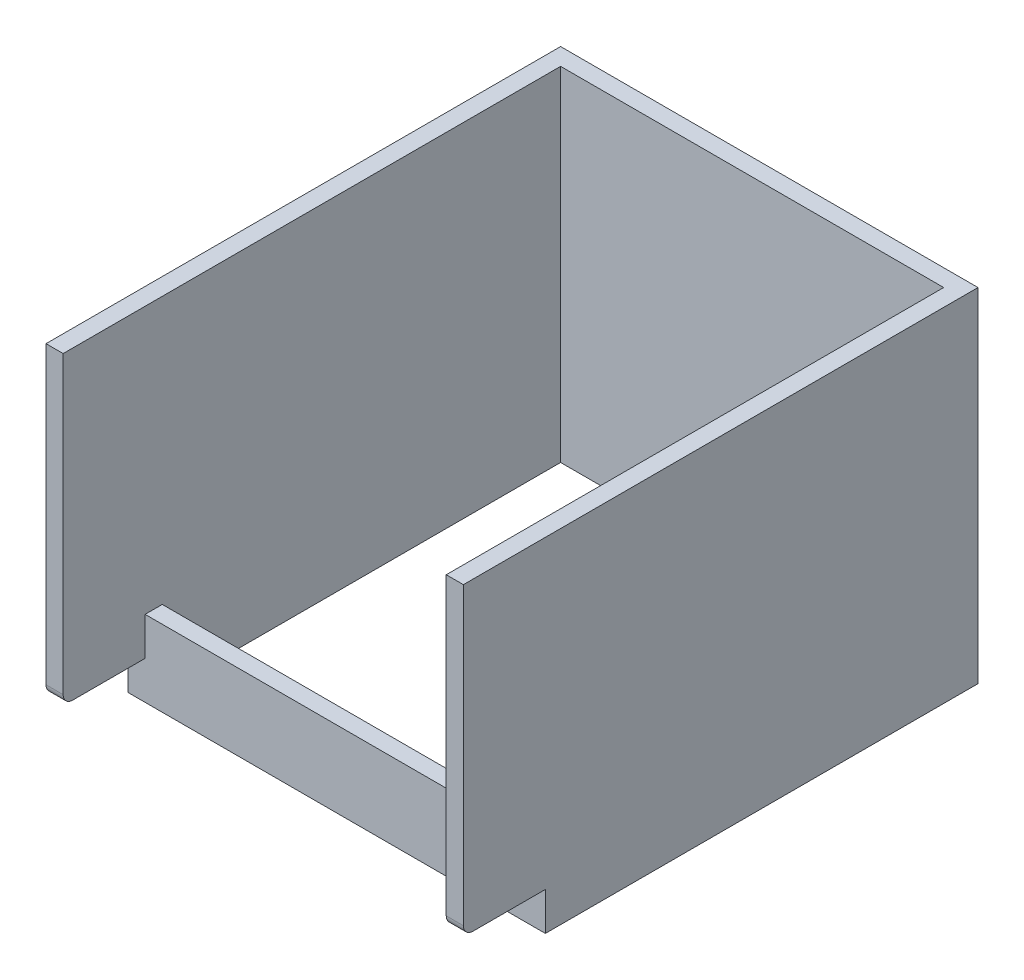
ISO-10303-21;
HEADER;
FILE_DESCRIPTION(('STEP AP214'),'2;1');
FILE_NAME('part.step','',(''),(''),'','','');
FILE_SCHEMA(('AUTOMOTIVE_DESIGN { 1 0 10303 214 1 1 1 1 }'));
ENDSEC;
DATA;
#1=APPLICATION_CONTEXT('core data for automotive mechanical design processes');
#2=APPLICATION_PROTOCOL_DEFINITION('international standard','automotive_design',2000,#1);
#3=PRODUCT_CONTEXT('',#1,'mechanical');
#4=PRODUCT('Part','Part','',(#3));
#5=PRODUCT_RELATED_PRODUCT_CATEGORY('part','',(#4));
#6=PRODUCT_DEFINITION_FORMATION('','',#4);
#7=PRODUCT_DEFINITION_CONTEXT('part definition',#1,'design');
#8=PRODUCT_DEFINITION('design','',#6,#7);
#9=PRODUCT_DEFINITION_SHAPE('','',#8);
#10=(LENGTH_UNIT() NAMED_UNIT(*) SI_UNIT(.MILLI.,.METRE.));
#11=(NAMED_UNIT(*) PLANE_ANGLE_UNIT() SI_UNIT($,.RADIAN.));
#12=(NAMED_UNIT(*) SI_UNIT($,.STERADIAN.) SOLID_ANGLE_UNIT());
#13=UNCERTAINTY_MEASURE_WITH_UNIT(LENGTH_MEASURE(1.E-05),#10,'distance_accuracy_value','');
#14=(GEOMETRIC_REPRESENTATION_CONTEXT(3) GLOBAL_UNCERTAINTY_ASSIGNED_CONTEXT((#13)) GLOBAL_UNIT_ASSIGNED_CONTEXT((#10,
#11,#12)) REPRESENTATION_CONTEXT('',''));
#15=CARTESIAN_POINT('',(0.,0.,0.));
#16=DIRECTION('',(0.,0.,1.));
#17=DIRECTION('',(1.,0.,0.));
#18=AXIS2_PLACEMENT_3D('',#15,#16,#17);
#19=CARTESIAN_POINT('',(0.,0.,0.));
#20=DIRECTION('',(0.,-1.,0.));
#21=DIRECTION('',(0.,0.,-1.));
#22=AXIS2_PLACEMENT_3D('',#19,#20,#21);
#23=PLANE('',#22);
#24=DIRECTION('',(0.,0.,-1.));
#25=VECTOR('',#24,1.);
#26=CARTESIAN_POINT('',(109.5,0.,125.));
#27=LINE('',#26,#25);
#28=CARTESIAN_POINT('',(109.5,0.,102.));
#29=VERTEX_POINT('',#28);
#30=CARTESIAN_POINT('',(109.5,0.,-125.));
#31=VERTEX_POINT('',#30);
#32=EDGE_CURVE('E245',#29,#31,#27,.T.);
#33=ORIENTED_EDGE('',*,*,#32,.F.);
#34=DIRECTION('',(1.,0.,0.));
#35=VECTOR('',#34,1.);
#36=CARTESIAN_POINT('',(-109.5,0.,102.));
#37=LINE('',#36,#35);
#38=CARTESIAN_POINT('',(-109.5,0.,102.));
#39=VERTEX_POINT('',#38);
#40=EDGE_CURVE('E199',#39,#29,#37,.T.);
#41=ORIENTED_EDGE('',*,*,#40,.F.);
#42=DIRECTION('',(0.,0.,1.));
#43=VECTOR('',#42,1.);
#44=CARTESIAN_POINT('',(-109.5,0.,125.));
#45=LINE('',#44,#43);
#46=CARTESIAN_POINT('',(-109.5,0.,-125.));
#47=VERTEX_POINT('',#46);
#48=EDGE_CURVE('E249',#47,#39,#45,.T.);
#49=ORIENTED_EDGE('',*,*,#48,.F.);
#50=DIRECTION('',(-1.,0.,0.));
#51=VECTOR('',#50,1.);
#52=CARTESIAN_POINT('',(-109.5,0.,-125.));
#53=LINE('',#52,#51);
#54=EDGE_CURVE('E247',#31,#47,#53,.T.);
#55=ORIENTED_EDGE('',*,*,#54,.F.);
#56=EDGE_LOOP('',(#33,#41,#49,#55));
#57=FACE_BOUND('',#56,.T.);
#58=DIRECTION('',(-1.,0.,0.));
#59=VECTOR('',#58,1.);
#60=CARTESIAN_POINT('',(-100.5,0.,-116.));
#61=LINE('',#60,#59);
#62=CARTESIAN_POINT('',(100.5,0.,-116.));
#63=VERTEX_POINT('',#62);
#64=CARTESIAN_POINT('',(-100.5,0.,-116.));
#65=VERTEX_POINT('',#64);
#66=EDGE_CURVE('E167',#63,#65,#61,.T.);
#67=ORIENTED_EDGE('',*,*,#66,.T.);
#68=DIRECTION('',(0.,0.,1.));
#69=VECTOR('',#68,1.);
#70=CARTESIAN_POINT('',(-100.5,0.,-116.));
#71=LINE('',#70,#69);
#72=CARTESIAN_POINT('',(-100.5,0.,93.));
#73=VERTEX_POINT('',#72);
#74=EDGE_CURVE('E149',#65,#73,#71,.T.);
#75=ORIENTED_EDGE('',*,*,#74,.T.);
#76=DIRECTION('',(1.,0.,0.));
#77=VECTOR('',#76,1.);
#78=CARTESIAN_POINT('',(-100.5,0.,93.));
#79=LINE('',#78,#77);
#80=CARTESIAN_POINT('',(100.5,0.,93.));
#81=VERTEX_POINT('',#80);
#82=EDGE_CURVE('E160',#73,#81,#79,.T.);
#83=ORIENTED_EDGE('',*,*,#82,.T.);
#84=DIRECTION('',(0.,0.,-1.));
#85=VECTOR('',#84,1.);
#86=CARTESIAN_POINT('',(100.5,0.,-116.));
#87=LINE('',#86,#85);
#88=EDGE_CURVE('E165',#81,#63,#87,.T.);
#89=ORIENTED_EDGE('',*,*,#88,.T.);
#90=EDGE_LOOP('',(#67,#75,#83,#89));
#91=FACE_BOUND('',#90,.T.);
#92=ADVANCED_FACE('F32',(#57,#91),#23,.T.);
#93=CARTESIAN_POINT('',(-100.5,180.,125.));
#94=DIRECTION('',(-1.,0.,0.));
#95=DIRECTION('',(0.,0.,1.));
#96=AXIS2_PLACEMENT_3D('',#93,#94,#95);
#97=PLANE('',#96);
#98=DIRECTION('',(0.,-1.,0.));
#99=VECTOR('',#98,1.);
#100=CARTESIAN_POINT('',(-100.5,40.,93.));
#101=LINE('',#100,#99);
#102=CARTESIAN_POINT('',(-100.5,40.,93.));
#103=VERTEX_POINT('',#102);
#104=EDGE_CURVE('E145',#103,#73,#101,.T.);
#105=ORIENTED_EDGE('',*,*,#104,.T.);
#106=ORIENTED_EDGE('',*,*,#74,.F.);
#107=DIRECTION('',(0.,-1.,0.));
#108=VECTOR('',#107,1.);
#109=CARTESIAN_POINT('',(-100.5,180.,-116.));
#110=LINE('',#109,#108);
#111=CARTESIAN_POINT('',(-100.5,180.,-116.));
#112=VERTEX_POINT('',#111);
#113=EDGE_CURVE('E47',#112,#65,#110,.T.);
#114=ORIENTED_EDGE('',*,*,#113,.F.);
#115=DIRECTION('',(0.,0.,-1.));
#116=VECTOR('',#115,1.);
#117=CARTESIAN_POINT('',(-100.5,180.,125.));
#118=LINE('',#117,#116);
#119=CARTESIAN_POINT('',(-100.5,180.,145.));
#120=VERTEX_POINT('',#119);
#121=EDGE_CURVE('E227',#120,#112,#118,.T.);
#122=ORIENTED_EDGE('',*,*,#121,.F.);
#123=DIRECTION('',(0.,-1.,0.));
#124=VECTOR('',#123,1.);
#125=CARTESIAN_POINT('',(-100.5,180.,145.));
#126=LINE('',#125,#124);
#127=CARTESIAN_POINT('',(-100.5,25.,145.));
#128=VERTEX_POINT('',#127);
#129=EDGE_CURVE('E235',#120,#128,#126,.T.);
#130=ORIENTED_EDGE('',*,*,#129,.T.);
#131=CARTESIAN_POINT('',(-100.5,25.,140.));
#132=DIRECTION('',(-1.,0.,0.));
#133=DIRECTION('',(0.,0.,1.));
#134=AXIS2_PLACEMENT_3D('',#131,#132,#133);
#135=CIRCLE('',#134,5.);
#136=CARTESIAN_POINT('',(-100.5,20.,140.));
#137=VERTEX_POINT('',#136);
#138=EDGE_CURVE('E265',#128,#137,#135,.F.);
#139=ORIENTED_EDGE('',*,*,#138,.T.);
#140=DIRECTION('',(0.,0.,-1.));
#141=VECTOR('',#140,1.);
#142=CARTESIAN_POINT('',(-100.5,20.,125.));
#143=LINE('',#142,#141);
#144=CARTESIAN_POINT('',(-100.5,20.,102.));
#145=VERTEX_POINT('',#144);
#146=EDGE_CURVE('E203',#137,#145,#143,.T.);
#147=ORIENTED_EDGE('',*,*,#146,.T.);
#148=DIRECTION('',(0.,-1.,0.));
#149=VECTOR('',#148,1.);
#150=CARTESIAN_POINT('',(-100.5,40.,102.));
#151=LINE('',#150,#149);
#152=CARTESIAN_POINT('',(-100.5,40.,102.));
#153=VERTEX_POINT('',#152);
#154=EDGE_CURVE('E184',#153,#145,#151,.T.);
#155=ORIENTED_EDGE('',*,*,#154,.F.);
#156=DIRECTION('',(0.,0.,1.));
#157=VECTOR('',#156,1.);
#158=CARTESIAN_POINT('',(-100.5,40.,102.));
#159=LINE('',#158,#157);
#160=EDGE_CURVE('E152',#103,#153,#159,.T.);
#161=ORIENTED_EDGE('',*,*,#160,.F.);
#162=EDGE_LOOP('',(#105,#106,#114,#122,#130,#139,#147,#155,#161));
#163=FACE_BOUND('',#162,.T.);
#164=ADVANCED_FACE('F147',(#163),#97,.F.);
#165=CARTESIAN_POINT('',(100.5,180.,-125.));
#166=DIRECTION('',(1.,0.,0.));
#167=DIRECTION('',(0.,0.,-1.));
#168=AXIS2_PLACEMENT_3D('',#165,#166,#167);
#169=PLANE('',#168);
#170=DIRECTION('',(0.,-1.,0.));
#171=VECTOR('',#170,1.);
#172=CARTESIAN_POINT('',(100.5,180.,-116.));
#173=LINE('',#172,#171);
#174=CARTESIAN_POINT('',(100.5,180.,-116.));
#175=VERTEX_POINT('',#174);
#176=EDGE_CURVE('E232',#175,#63,#173,.T.);
#177=ORIENTED_EDGE('',*,*,#176,.T.);
#178=ORIENTED_EDGE('',*,*,#88,.F.);
#179=DIRECTION('',(0.,-1.,0.));
#180=VECTOR('',#179,1.);
#181=CARTESIAN_POINT('',(100.5,40.,93.));
#182=LINE('',#181,#180);
#183=CARTESIAN_POINT('',(100.5,40.,93.));
#184=VERTEX_POINT('',#183);
#185=EDGE_CURVE('E156',#184,#81,#182,.T.);
#186=ORIENTED_EDGE('',*,*,#185,.F.);
#187=DIRECTION('',(0.,0.,-1.));
#188=VECTOR('',#187,1.);
#189=CARTESIAN_POINT('',(100.5,40.,102.));
#190=LINE('',#189,#188);
#191=CARTESIAN_POINT('',(100.5,40.,102.));
#192=VERTEX_POINT('',#191);
#193=EDGE_CURVE('E176',#192,#184,#190,.T.);
#194=ORIENTED_EDGE('',*,*,#193,.F.);
#195=DIRECTION('',(0.,-1.,0.));
#196=VECTOR('',#195,1.);
#197=CARTESIAN_POINT('',(100.5,40.,102.));
#198=LINE('',#197,#196);
#199=CARTESIAN_POINT('',(100.5,20.,102.));
#200=VERTEX_POINT('',#199);
#201=EDGE_CURVE('E181',#192,#200,#198,.T.);
#202=ORIENTED_EDGE('',*,*,#201,.T.);
#203=DIRECTION('',(0.,0.,1.));
#204=VECTOR('',#203,1.);
#205=CARTESIAN_POINT('',(100.5,20.,-125.));
#206=LINE('',#205,#204);
#207=CARTESIAN_POINT('',(100.5,20.,140.));
#208=VERTEX_POINT('',#207);
#209=EDGE_CURVE('E207',#200,#208,#206,.T.);
#210=ORIENTED_EDGE('',*,*,#209,.T.);
#211=CARTESIAN_POINT('',(100.5,25.,140.));
#212=DIRECTION('',(1.,0.,0.));
#213=DIRECTION('',(0.,0.,-1.));
#214=AXIS2_PLACEMENT_3D('',#211,#212,#213);
#215=CIRCLE('',#214,5.);
#216=CARTESIAN_POINT('',(100.5,25.,145.));
#217=VERTEX_POINT('',#216);
#218=EDGE_CURVE('E270',#208,#217,#215,.F.);
#219=ORIENTED_EDGE('',*,*,#218,.T.);
#220=DIRECTION('',(0.,-1.,0.));
#221=VECTOR('',#220,1.);
#222=CARTESIAN_POINT('',(100.5,180.,145.));
#223=LINE('',#222,#221);
#224=CARTESIAN_POINT('',(100.5,180.,145.));
#225=VERTEX_POINT('',#224);
#226=EDGE_CURVE('E243',#225,#217,#223,.T.);
#227=ORIENTED_EDGE('',*,*,#226,.F.);
#228=DIRECTION('',(0.,0.,1.));
#229=VECTOR('',#228,1.);
#230=CARTESIAN_POINT('',(100.5,180.,125.));
#231=LINE('',#230,#229);
#232=EDGE_CURVE('E210',#175,#225,#231,.T.);
#233=ORIENTED_EDGE('',*,*,#232,.F.);
#234=EDGE_LOOP('',(#177,#178,#186,#194,#202,#210,#219,#227,#233));
#235=FACE_BOUND('',#234,.T.);
#236=ADVANCED_FACE('F273',(#235),#169,.F.);
#237=CARTESIAN_POINT('',(109.5,3.,125.));
#238=DIRECTION('',(-1.,0.,0.));
#239=DIRECTION('',(0.,0.,1.));
#240=AXIS2_PLACEMENT_3D('',#237,#238,#239);
#241=PLANE('',#240);
#242=DIRECTION('',(0.,-1.,0.));
#243=VECTOR('',#242,1.);
#244=CARTESIAN_POINT('',(109.5,180.,145.));
#245=LINE('',#244,#243);
#246=CARTESIAN_POINT('',(109.5,180.,145.));
#247=VERTEX_POINT('',#246);
#248=CARTESIAN_POINT('',(109.5,25.,145.));
#249=VERTEX_POINT('',#248);
#250=EDGE_CURVE('E241',#247,#249,#245,.T.);
#251=ORIENTED_EDGE('',*,*,#250,.T.);
#252=CARTESIAN_POINT('',(109.5,25.,140.));
#253=DIRECTION('',(-1.,0.,0.));
#254=DIRECTION('',(0.,0.,1.));
#255=AXIS2_PLACEMENT_3D('',#252,#253,#254);
#256=CIRCLE('',#255,5.);
#257=CARTESIAN_POINT('',(109.5,20.,140.));
#258=VERTEX_POINT('',#257);
#259=EDGE_CURVE('E11',#249,#258,#256,.F.);
#260=ORIENTED_EDGE('',*,*,#259,.T.);
#261=DIRECTION('',(0.,0.,1.));
#262=VECTOR('',#261,1.);
#263=CARTESIAN_POINT('',(109.5,20.,167.933085687635));
#264=LINE('',#263,#262);
#265=CARTESIAN_POINT('',(109.5,20.,102.));
#266=VERTEX_POINT('',#265);
#267=EDGE_CURVE('E190',#266,#258,#264,.T.);
#268=ORIENTED_EDGE('',*,*,#267,.F.);
#269=DIRECTION('',(0.,1.,0.));
#270=VECTOR('',#269,1.);
#271=CARTESIAN_POINT('',(109.5,0.,102.));
#272=LINE('',#271,#270);
#273=EDGE_CURVE('E187',#29,#266,#272,.T.);
#274=ORIENTED_EDGE('',*,*,#273,.F.);
#275=ORIENTED_EDGE('',*,*,#32,.T.);
#276=DIRECTION('',(0.,-1.,0.));
#277=VECTOR('',#276,1.);
#278=CARTESIAN_POINT('',(109.5,3.,-125.));
#279=LINE('',#278,#277);
#280=CARTESIAN_POINT('',(109.5,180.,-125.));
#281=VERTEX_POINT('',#280);
#282=EDGE_CURVE('E255',#281,#31,#279,.T.);
#283=ORIENTED_EDGE('',*,*,#282,.F.);
#284=DIRECTION('',(0.,0.,1.));
#285=VECTOR('',#284,1.);
#286=CARTESIAN_POINT('',(109.5,180.,125.));
#287=LINE('',#286,#285);
#288=EDGE_CURVE('E215',#281,#247,#287,.T.);
#289=ORIENTED_EDGE('',*,*,#288,.T.);
#290=EDGE_LOOP('',(#251,#260,#268,#274,#275,#283,#289));
#291=FACE_BOUND('',#290,.T.);
#292=ADVANCED_FACE('F282',(#291),#241,.F.);
#293=CARTESIAN_POINT('',(-109.5,3.,-125.));
#294=DIRECTION('',(0.,0.,1.));
#295=DIRECTION('',(1.,0.,0.));
#296=AXIS2_PLACEMENT_3D('',#293,#294,#295);
#297=PLANE('',#296);
#298=ORIENTED_EDGE('',*,*,#54,.T.);
#299=DIRECTION('',(0.,-1.,0.));
#300=VECTOR('',#299,1.);
#301=CARTESIAN_POINT('',(-109.5,3.,-125.));
#302=LINE('',#301,#300);
#303=CARTESIAN_POINT('',(-109.5,180.,-125.));
#304=VERTEX_POINT('',#303);
#305=EDGE_CURVE('E252',#304,#47,#302,.T.);
#306=ORIENTED_EDGE('',*,*,#305,.F.);
#307=DIRECTION('',(1.,0.,0.));
#308=VECTOR('',#307,1.);
#309=CARTESIAN_POINT('',(-109.5,180.,-125.));
#310=LINE('',#309,#308);
#311=EDGE_CURVE('E218',#304,#281,#310,.T.);
#312=ORIENTED_EDGE('',*,*,#311,.T.);
#313=ORIENTED_EDGE('',*,*,#282,.T.);
#314=EDGE_LOOP('',(#298,#306,#312,#313));
#315=FACE_BOUND('',#314,.T.);
#316=ADVANCED_FACE('F295',(#315),#297,.F.);
#317=CARTESIAN_POINT('',(-109.5,3.,125.));
#318=DIRECTION('',(1.,0.,0.));
#319=DIRECTION('',(0.,0.,-1.));
#320=AXIS2_PLACEMENT_3D('',#317,#318,#319);
#321=PLANE('',#320);
#322=DIRECTION('',(0.,0.,1.));
#323=VECTOR('',#322,1.);
#324=CARTESIAN_POINT('',(-109.5,20.,167.933085687635));
#325=LINE('',#324,#323);
#326=CARTESIAN_POINT('',(-109.5,20.,102.));
#327=VERTEX_POINT('',#326);
#328=CARTESIAN_POINT('',(-109.5,20.,140.));
#329=VERTEX_POINT('',#328);
#330=EDGE_CURVE('E196',#327,#329,#325,.T.);
#331=ORIENTED_EDGE('',*,*,#330,.T.);
#332=CARTESIAN_POINT('',(-109.5,25.,140.));
#333=DIRECTION('',(1.,0.,0.));
#334=DIRECTION('',(0.,0.,-1.));
#335=AXIS2_PLACEMENT_3D('',#332,#333,#334);
#336=CIRCLE('',#335,5.);
#337=CARTESIAN_POINT('',(-109.5,25.,145.));
#338=VERTEX_POINT('',#337);
#339=EDGE_CURVE('E261',#329,#338,#336,.F.);
#340=ORIENTED_EDGE('',*,*,#339,.T.);
#341=DIRECTION('',(0.,-1.,0.));
#342=VECTOR('',#341,1.);
#343=CARTESIAN_POINT('',(-109.5,180.,145.));
#344=LINE('',#343,#342);
#345=CARTESIAN_POINT('',(-109.5,180.,145.));
#346=VERTEX_POINT('',#345);
#347=EDGE_CURVE('E238',#346,#338,#344,.T.);
#348=ORIENTED_EDGE('',*,*,#347,.F.);
#349=DIRECTION('',(0.,0.,-1.));
#350=VECTOR('',#349,1.);
#351=CARTESIAN_POINT('',(-109.5,180.,125.));
#352=LINE('',#351,#350);
#353=EDGE_CURVE('E221',#346,#304,#352,.T.);
#354=ORIENTED_EDGE('',*,*,#353,.T.);
#355=ORIENTED_EDGE('',*,*,#305,.T.);
#356=ORIENTED_EDGE('',*,*,#48,.T.);
#357=DIRECTION('',(0.,1.,0.));
#358=VECTOR('',#357,1.);
#359=CARTESIAN_POINT('',(-109.5,0.,102.));
#360=LINE('',#359,#358);
#361=EDGE_CURVE('E193',#39,#327,#360,.T.);
#362=ORIENTED_EDGE('',*,*,#361,.T.);
#363=EDGE_LOOP('',(#331,#340,#348,#354,#355,#356,#362));
#364=FACE_BOUND('',#363,.T.);
#365=ADVANCED_FACE('F303',(#364),#321,.F.);
#366=CARTESIAN_POINT('',(-109.5,180.,-116.));
#367=DIRECTION('',(0.,0.,-1.));
#368=DIRECTION('',(-1.,0.,0.));
#369=AXIS2_PLACEMENT_3D('',#366,#367,#368);
#370=PLANE('',#369);
#371=ORIENTED_EDGE('',*,*,#113,.T.);
#372=ORIENTED_EDGE('',*,*,#66,.F.);
#373=ORIENTED_EDGE('',*,*,#176,.F.);
#374=DIRECTION('',(1.,0.,0.));
#375=VECTOR('',#374,1.);
#376=CARTESIAN_POINT('',(-109.5,180.,-116.));
#377=LINE('',#376,#375);
#378=EDGE_CURVE('E229',#112,#175,#377,.T.);
#379=ORIENTED_EDGE('',*,*,#378,.F.);
#380=EDGE_LOOP('',(#371,#372,#373,#379));
#381=FACE_BOUND('',#380,.T.);
#382=ADVANCED_FACE('F301',(#381),#370,.F.);
#383=CARTESIAN_POINT('',(109.5,180.,145.));
#384=DIRECTION('',(0.,0.,1.));
#385=DIRECTION('',(1.,0.,0.));
#386=AXIS2_PLACEMENT_3D('',#383,#384,#385);
#387=PLANE('',#386);
#388=ORIENTED_EDGE('',*,*,#226,.T.);
#389=DIRECTION('',(-1.,0.,0.));
#390=VECTOR('',#389,1.);
#391=CARTESIAN_POINT('',(109.5,25.,145.));
#392=LINE('',#391,#390);
#393=EDGE_CURVE('E40',#217,#249,#392,.F.);
#394=ORIENTED_EDGE('',*,*,#393,.T.);
#395=ORIENTED_EDGE('',*,*,#250,.F.);
#396=DIRECTION('',(-1.,0.,0.));
#397=VECTOR('',#396,1.);
#398=CARTESIAN_POINT('',(109.5,180.,145.));
#399=LINE('',#398,#397);
#400=EDGE_CURVE('E212',#247,#225,#399,.T.);
#401=ORIENTED_EDGE('',*,*,#400,.T.);
#402=EDGE_LOOP('',(#388,#394,#395,#401));
#403=FACE_BOUND('',#402,.T.);
#404=ADVANCED_FACE('F277',(#403),#387,.T.);
#405=CARTESIAN_POINT('',(-100.5,180.,145.));
#406=DIRECTION('',(0.,0.,1.));
#407=DIRECTION('',(1.,0.,0.));
#408=AXIS2_PLACEMENT_3D('',#405,#406,#407);
#409=PLANE('',#408);
#410=ORIENTED_EDGE('',*,*,#347,.T.);
#411=DIRECTION('',(-1.,0.,0.));
#412=VECTOR('',#411,1.);
#413=CARTESIAN_POINT('',(-100.5,25.,145.));
#414=LINE('',#413,#412);
#415=EDGE_CURVE('E263',#338,#128,#414,.F.);
#416=ORIENTED_EDGE('',*,*,#415,.T.);
#417=ORIENTED_EDGE('',*,*,#129,.F.);
#418=DIRECTION('',(-1.,0.,0.));
#419=VECTOR('',#418,1.);
#420=CARTESIAN_POINT('',(-100.5,180.,145.));
#421=LINE('',#420,#419);
#422=EDGE_CURVE('E224',#120,#346,#421,.T.);
#423=ORIENTED_EDGE('',*,*,#422,.T.);
#424=EDGE_LOOP('',(#410,#416,#417,#423));
#425=FACE_BOUND('',#424,.T.);
#426=ADVANCED_FACE('F309',(#425),#409,.T.);
#427=CARTESIAN_POINT('',(0.,180.,0.));
#428=DIRECTION('',(0.,-1.,0.));
#429=DIRECTION('',(-1.,0.,0.));
#430=AXIS2_PLACEMENT_3D('',#427,#428,#429);
#431=PLANE('',#430);
#432=ORIENTED_EDGE('',*,*,#232,.T.);
#433=ORIENTED_EDGE('',*,*,#400,.F.);
#434=ORIENTED_EDGE('',*,*,#288,.F.);
#435=ORIENTED_EDGE('',*,*,#311,.F.);
#436=ORIENTED_EDGE('',*,*,#353,.F.);
#437=ORIENTED_EDGE('',*,*,#422,.F.);
#438=ORIENTED_EDGE('',*,*,#121,.T.);
#439=ORIENTED_EDGE('',*,*,#378,.T.);
#440=EDGE_LOOP('',(#432,#433,#434,#435,#436,#437,#438,#439));
#441=FACE_BOUND('',#440,.T.);
#442=ADVANCED_FACE('F299',(#441),#431,.F.);
#443=CARTESIAN_POINT('',(-109.5,0.,102.));
#444=DIRECTION('',(0.,0.,-1.));
#445=DIRECTION('',(-1.,0.,0.));
#446=AXIS2_PLACEMENT_3D('',#443,#444,#445);
#447=PLANE('',#446);
#448=ORIENTED_EDGE('',*,*,#154,.T.);
#449=DIRECTION('',(1.,0.,0.));
#450=VECTOR('',#449,1.);
#451=CARTESIAN_POINT('',(-109.5,20.,102.));
#452=LINE('',#451,#450);
#453=EDGE_CURVE('E200',#327,#145,#452,.T.);
#454=ORIENTED_EDGE('',*,*,#453,.F.);
#455=ORIENTED_EDGE('',*,*,#361,.F.);
#456=ORIENTED_EDGE('',*,*,#40,.T.);
#457=ORIENTED_EDGE('',*,*,#273,.T.);
#458=EDGE_CURVE('E204',#200,#266,#452,.T.);
#459=ORIENTED_EDGE('',*,*,#458,.F.);
#460=ORIENTED_EDGE('',*,*,#201,.F.);
#461=DIRECTION('',(1.,0.,0.));
#462=VECTOR('',#461,1.);
#463=CARTESIAN_POINT('',(-100.5,40.,102.));
#464=LINE('',#463,#462);
#465=EDGE_CURVE('E173',#153,#192,#464,.T.);
#466=ORIENTED_EDGE('',*,*,#465,.F.);
#467=EDGE_LOOP('',(#448,#454,#455,#456,#457,#459,#460,#466));
#468=FACE_BOUND('',#467,.T.);
#469=ADVANCED_FACE('F288',(#468),#447,.F.);
#470=CARTESIAN_POINT('',(-109.5,20.,167.933085687635));
#471=DIRECTION('',(0.,1.,0.));
#472=DIRECTION('',(0.,0.,1.));
#473=AXIS2_PLACEMENT_3D('',#470,#471,#472);
#474=PLANE('',#473);
#475=ORIENTED_EDGE('',*,*,#267,.T.);
#476=DIRECTION('',(-1.,0.,0.));
#477=VECTOR('',#476,1.);
#478=CARTESIAN_POINT('',(100.5,20.,140.));
#479=LINE('',#478,#477);
#480=EDGE_CURVE('E267',#258,#208,#479,.T.);
#481=ORIENTED_EDGE('',*,*,#480,.T.);
#482=ORIENTED_EDGE('',*,*,#209,.F.);
#483=ORIENTED_EDGE('',*,*,#458,.T.);
#484=EDGE_LOOP('',(#475,#481,#482,#483));
#485=FACE_BOUND('',#484,.T.);
#486=ADVANCED_FACE('F285',(#485),#474,.F.);
#487=ORIENTED_EDGE('',*,*,#146,.F.);
#488=DIRECTION('',(-1.,0.,0.));
#489=VECTOR('',#488,1.);
#490=CARTESIAN_POINT('',(-109.5,20.,140.));
#491=LINE('',#490,#489);
#492=EDGE_CURVE('E258',#137,#329,#491,.T.);
#493=ORIENTED_EDGE('',*,*,#492,.T.);
#494=ORIENTED_EDGE('',*,*,#330,.F.);
#495=ORIENTED_EDGE('',*,*,#453,.T.);
#496=EDGE_LOOP('',(#487,#493,#494,#495));
#497=FACE_BOUND('',#496,.T.);
#498=ADVANCED_FACE('F341',(#497),#474,.F.);
#499=CARTESIAN_POINT('',(-100.5,40.,93.));
#500=DIRECTION('',(0.,0.,1.));
#501=DIRECTION('',(1.,0.,0.));
#502=AXIS2_PLACEMENT_3D('',#499,#500,#501);
#503=PLANE('',#502);
#504=ORIENTED_EDGE('',*,*,#185,.T.);
#505=ORIENTED_EDGE('',*,*,#82,.F.);
#506=ORIENTED_EDGE('',*,*,#104,.F.);
#507=DIRECTION('',(-1.,0.,0.));
#508=VECTOR('',#507,1.);
#509=CARTESIAN_POINT('',(-100.5,40.,93.));
#510=LINE('',#509,#508);
#511=EDGE_CURVE('E157',#184,#103,#510,.T.);
#512=ORIENTED_EDGE('',*,*,#511,.F.);
#513=EDGE_LOOP('',(#504,#505,#506,#512));
#514=FACE_BOUND('',#513,.T.);
#515=ADVANCED_FACE('F161',(#514),#503,.F.);
#516=CARTESIAN_POINT('',(0.,40.,0.));
#517=DIRECTION('',(0.,-1.,0.));
#518=DIRECTION('',(0.,0.,-1.));
#519=AXIS2_PLACEMENT_3D('',#516,#517,#518);
#520=PLANE('',#519);
#521=ORIENTED_EDGE('',*,*,#160,.T.);
#522=ORIENTED_EDGE('',*,*,#465,.T.);
#523=ORIENTED_EDGE('',*,*,#193,.T.);
#524=ORIENTED_EDGE('',*,*,#511,.T.);
#525=EDGE_LOOP('',(#521,#522,#523,#524));
#526=FACE_BOUND('',#525,.T.);
#527=ADVANCED_FACE('F327',(#526),#520,.F.);
#528=CARTESIAN_POINT('',(-109.5,25.,140.));
#529=DIRECTION('',(1.,0.,0.));
#530=DIRECTION('',(0.,0.,-1.));
#531=AXIS2_PLACEMENT_3D('',#528,#529,#530);
#532=CYLINDRICAL_SURFACE('',#531,5.);
#533=ORIENTED_EDGE('',*,*,#138,.F.);
#534=ORIENTED_EDGE('',*,*,#415,.F.);
#535=ORIENTED_EDGE('',*,*,#339,.F.);
#536=ORIENTED_EDGE('',*,*,#492,.F.);
#537=EDGE_LOOP('',(#533,#534,#535,#536));
#538=FACE_BOUND('',#537,.T.);
#539=ADVANCED_FACE('F325',(#538),#532,.T.);
#540=CARTESIAN_POINT('',(-109.5,25.,140.));
#541=DIRECTION('',(1.,0.,0.));
#542=DIRECTION('',(0.,0.,-1.));
#543=AXIS2_PLACEMENT_3D('',#540,#541,#542);
#544=CYLINDRICAL_SURFACE('',#543,5.);
#545=ORIENTED_EDGE('',*,*,#259,.F.);
#546=ORIENTED_EDGE('',*,*,#393,.F.);
#547=ORIENTED_EDGE('',*,*,#218,.F.);
#548=ORIENTED_EDGE('',*,*,#480,.F.);
#549=EDGE_LOOP('',(#545,#546,#547,#548));
#550=FACE_BOUND('',#549,.T.);
#551=ADVANCED_FACE('F34',(#550),#544,.T.);
#552=CLOSED_SHELL('',(#92,#164,#236,#292,#316,#365,#382,#404,#426,#442,#469,#486,#498,#515,#527,
#539,#551));
#553=MANIFOLD_SOLID_BREP('B2',#552);
#554=ADVANCED_BREP_SHAPE_REPRESENTATION('',(#18,#553),#14);
#555=SHAPE_DEFINITION_REPRESENTATION(#9,#554);
ENDSEC;
END-ISO-10303-21;
